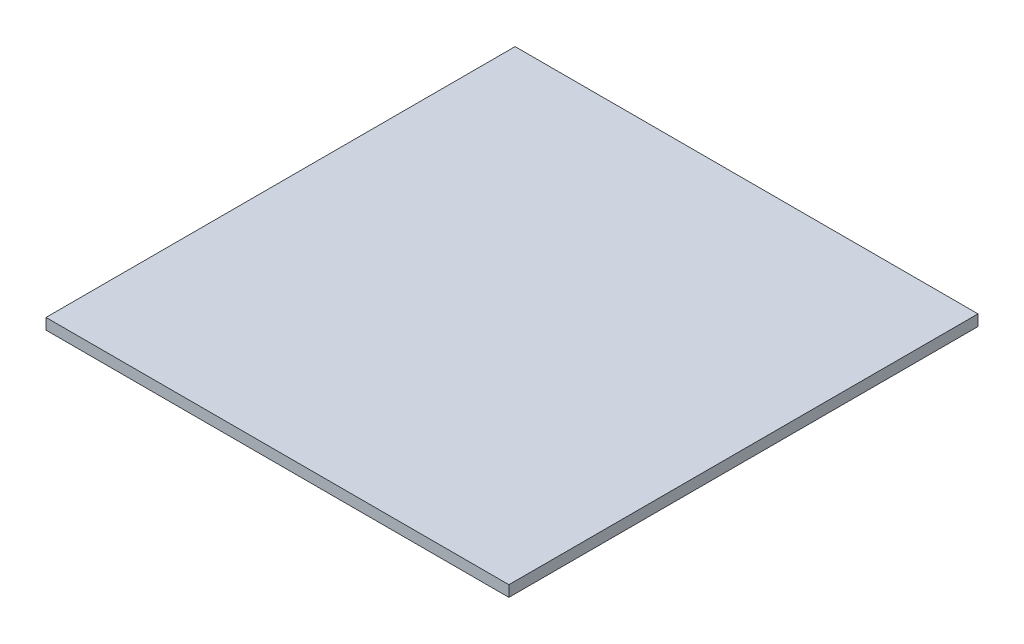
ISO-10303-21;
HEADER;
FILE_DESCRIPTION(('STEP AP214'),'2;1');
FILE_NAME('part.step','',(''),(''),'','','');
FILE_SCHEMA(('AUTOMOTIVE_DESIGN { 1 0 10303 214 1 1 1 1 }'));
ENDSEC;
DATA;
#1=APPLICATION_CONTEXT('core data for automotive mechanical design processes');
#2=APPLICATION_PROTOCOL_DEFINITION('international standard','automotive_design',2000,#1);
#3=PRODUCT_CONTEXT('',#1,'mechanical');
#4=PRODUCT('Part','Part','',(#3));
#5=PRODUCT_RELATED_PRODUCT_CATEGORY('part','',(#4));
#6=PRODUCT_DEFINITION_FORMATION('','',#4);
#7=PRODUCT_DEFINITION_CONTEXT('part definition',#1,'design');
#8=PRODUCT_DEFINITION('design','',#6,#7);
#9=PRODUCT_DEFINITION_SHAPE('','',#8);
#10=(LENGTH_UNIT() NAMED_UNIT(*) SI_UNIT(.MILLI.,.METRE.));
#11=(NAMED_UNIT(*) PLANE_ANGLE_UNIT() SI_UNIT($,.RADIAN.));
#12=(NAMED_UNIT(*) SI_UNIT($,.STERADIAN.) SOLID_ANGLE_UNIT());
#13=UNCERTAINTY_MEASURE_WITH_UNIT(LENGTH_MEASURE(1.E-05),#10,'distance_accuracy_value','');
#14=(GEOMETRIC_REPRESENTATION_CONTEXT(3) GLOBAL_UNCERTAINTY_ASSIGNED_CONTEXT((#13)) GLOBAL_UNIT_ASSIGNED_CONTEXT((#10,
#11,#12)) REPRESENTATION_CONTEXT('',''));
#15=CARTESIAN_POINT('',(0.,0.,0.));
#16=DIRECTION('',(0.,0.,1.));
#17=DIRECTION('',(1.,0.,0.));
#18=AXIS2_PLACEMENT_3D('',#15,#16,#17);
#19=CARTESIAN_POINT('',(0.,1.87,-79.55));
#20=DIRECTION('',(1.,0.,0.));
#21=DIRECTION('',(0.,0.,-1.));
#22=AXIS2_PLACEMENT_3D('',#19,#20,#21);
#23=PLANE('',#22);
#24=DIRECTION('',(0.,0.,1.));
#25=VECTOR('',#24,1.);
#26=CARTESIAN_POINT('',(0.,0.,-79.55));
#27=LINE('',#26,#25);
#28=CARTESIAN_POINT('',(0.,0.,-79.55));
#29=VERTEX_POINT('',#28);
#30=CARTESIAN_POINT('',(0.,0.,0.));
#31=VERTEX_POINT('',#30);
#32=EDGE_CURVE('E96',#29,#31,#27,.T.);
#33=ORIENTED_EDGE('',*,*,#32,.T.);
#34=DIRECTION('',(0.,-1.,0.));
#35=VECTOR('',#34,1.);
#36=CARTESIAN_POINT('',(0.,1.87,0.));
#37=LINE('',#36,#35);
#38=CARTESIAN_POINT('',(0.,1.87,0.));
#39=VERTEX_POINT('',#38);
#40=EDGE_CURVE('E11',#39,#31,#37,.T.);
#41=ORIENTED_EDGE('',*,*,#40,.F.);
#42=DIRECTION('',(0.,0.,1.));
#43=VECTOR('',#42,1.);
#44=CARTESIAN_POINT('',(0.,1.87,-79.55));
#45=LINE('',#44,#43);
#46=CARTESIAN_POINT('',(0.,1.87,-79.55));
#47=VERTEX_POINT('',#46);
#48=EDGE_CURVE('E84',#47,#39,#45,.T.);
#49=ORIENTED_EDGE('',*,*,#48,.F.);
#50=DIRECTION('',(0.,-1.,0.));
#51=VECTOR('',#50,1.);
#52=CARTESIAN_POINT('',(0.,1.87,-79.55));
#53=LINE('',#52,#51);
#54=EDGE_CURVE('E92',#47,#29,#53,.T.);
#55=ORIENTED_EDGE('',*,*,#54,.T.);
#56=EDGE_LOOP('',(#33,#41,#49,#55));
#57=FACE_BOUND('',#56,.T.);
#58=ADVANCED_FACE('F33',(#57),#23,.F.);
#59=CARTESIAN_POINT('',(0.,1.87,0.));
#60=DIRECTION('',(0.,0.,-1.));
#61=DIRECTION('',(-1.,0.,0.));
#62=AXIS2_PLACEMENT_3D('',#59,#60,#61);
#63=PLANE('',#62);
#64=DIRECTION('',(1.,0.,0.));
#65=VECTOR('',#64,1.);
#66=CARTESIAN_POINT('',(0.,0.,0.));
#67=LINE('',#66,#65);
#68=CARTESIAN_POINT('',(78.5,0.,0.));
#69=VERTEX_POINT('',#68);
#70=EDGE_CURVE('E88',#31,#69,#67,.T.);
#71=ORIENTED_EDGE('',*,*,#70,.T.);
#72=DIRECTION('',(0.,-1.,0.));
#73=VECTOR('',#72,1.);
#74=CARTESIAN_POINT('',(78.5,1.87,0.));
#75=LINE('',#74,#73);
#76=CARTESIAN_POINT('',(78.5,1.87,0.));
#77=VERTEX_POINT('',#76);
#78=EDGE_CURVE('E41',#77,#69,#75,.T.);
#79=ORIENTED_EDGE('',*,*,#78,.F.);
#80=DIRECTION('',(1.,0.,0.));
#81=VECTOR('',#80,1.);
#82=CARTESIAN_POINT('',(0.,1.87,0.));
#83=LINE('',#82,#81);
#84=EDGE_CURVE('E79',#39,#77,#83,.T.);
#85=ORIENTED_EDGE('',*,*,#84,.F.);
#86=ORIENTED_EDGE('',*,*,#40,.T.);
#87=EDGE_LOOP('',(#71,#79,#85,#86));
#88=FACE_BOUND('',#87,.T.);
#89=ADVANCED_FACE('F87',(#88),#63,.F.);
#90=CARTESIAN_POINT('',(78.5,1.87,0.));
#91=DIRECTION('',(-1.,0.,0.));
#92=DIRECTION('',(0.,0.,1.));
#93=AXIS2_PLACEMENT_3D('',#90,#91,#92);
#94=PLANE('',#93);
#95=DIRECTION('',(0.,0.,-1.));
#96=VECTOR('',#95,1.);
#97=CARTESIAN_POINT('',(78.5,0.,0.));
#98=LINE('',#97,#96);
#99=CARTESIAN_POINT('',(78.5,0.,-79.55));
#100=VERTEX_POINT('',#99);
#101=EDGE_CURVE('E66',#69,#100,#98,.T.);
#102=ORIENTED_EDGE('',*,*,#101,.T.);
#103=DIRECTION('',(0.,-1.,0.));
#104=VECTOR('',#103,1.);
#105=CARTESIAN_POINT('',(78.5,1.87,-79.55));
#106=LINE('',#105,#104);
#107=CARTESIAN_POINT('',(78.5,1.87,-79.55));
#108=VERTEX_POINT('',#107);
#109=EDGE_CURVE('E89',#108,#100,#106,.T.);
#110=ORIENTED_EDGE('',*,*,#109,.F.);
#111=DIRECTION('',(0.,0.,-1.));
#112=VECTOR('',#111,1.);
#113=CARTESIAN_POINT('',(78.5,1.87,0.));
#114=LINE('',#113,#112);
#115=EDGE_CURVE('E82',#77,#108,#114,.T.);
#116=ORIENTED_EDGE('',*,*,#115,.F.);
#117=ORIENTED_EDGE('',*,*,#78,.T.);
#118=EDGE_LOOP('',(#102,#110,#116,#117));
#119=FACE_BOUND('',#118,.T.);
#120=ADVANCED_FACE('F90',(#119),#94,.F.);
#121=CARTESIAN_POINT('',(78.5,1.87,-79.55));
#122=DIRECTION('',(0.,0.,1.));
#123=DIRECTION('',(1.,0.,0.));
#124=AXIS2_PLACEMENT_3D('',#121,#122,#123);
#125=PLANE('',#124);
#126=DIRECTION('',(-1.,0.,0.));
#127=VECTOR('',#126,1.);
#128=CARTESIAN_POINT('',(78.5,0.,-79.55));
#129=LINE('',#128,#127);
#130=EDGE_CURVE('E72',#100,#29,#129,.T.);
#131=ORIENTED_EDGE('',*,*,#130,.T.);
#132=ORIENTED_EDGE('',*,*,#54,.F.);
#133=DIRECTION('',(-1.,0.,0.));
#134=VECTOR('',#133,1.);
#135=CARTESIAN_POINT('',(78.5,1.87,-79.55));
#136=LINE('',#135,#134);
#137=EDGE_CURVE('E49',#108,#47,#136,.T.);
#138=ORIENTED_EDGE('',*,*,#137,.F.);
#139=ORIENTED_EDGE('',*,*,#109,.T.);
#140=EDGE_LOOP('',(#131,#132,#138,#139));
#141=FACE_BOUND('',#140,.T.);
#142=ADVANCED_FACE('F103',(#141),#125,.F.);
#143=CARTESIAN_POINT('',(0.,1.87,0.));
#144=DIRECTION('',(0.,1.,0.));
#145=DIRECTION('',(0.,0.,1.));
#146=AXIS2_PLACEMENT_3D('',#143,#144,#145);
#147=PLANE('',#146);
#148=ORIENTED_EDGE('',*,*,#48,.T.);
#149=ORIENTED_EDGE('',*,*,#84,.T.);
#150=ORIENTED_EDGE('',*,*,#115,.T.);
#151=ORIENTED_EDGE('',*,*,#137,.T.);
#152=EDGE_LOOP('',(#148,#149,#150,#151));
#153=FACE_BOUND('',#152,.T.);
#154=ADVANCED_FACE('F80',(#153),#147,.T.);
#155=CARTESIAN_POINT('',(0.,0.,0.));
#156=DIRECTION('',(0.,1.,0.));
#157=DIRECTION('',(0.,0.,1.));
#158=AXIS2_PLACEMENT_3D('',#155,#156,#157);
#159=PLANE('',#158);
#160=ORIENTED_EDGE('',*,*,#32,.F.);
#161=ORIENTED_EDGE('',*,*,#130,.F.);
#162=ORIENTED_EDGE('',*,*,#101,.F.);
#163=ORIENTED_EDGE('',*,*,#70,.F.);
#164=EDGE_LOOP('',(#160,#161,#162,#163));
#165=FACE_BOUND('',#164,.T.);
#166=ADVANCED_FACE('F106',(#165),#159,.F.);
#167=CLOSED_SHELL('',(#58,#89,#120,#142,#154,#166));
#168=MANIFOLD_SOLID_BREP('B2',#167);
#169=ADVANCED_BREP_SHAPE_REPRESENTATION('',(#18,#168),#14);
#170=SHAPE_DEFINITION_REPRESENTATION(#9,#169);
ENDSEC;
END-ISO-10303-21;
